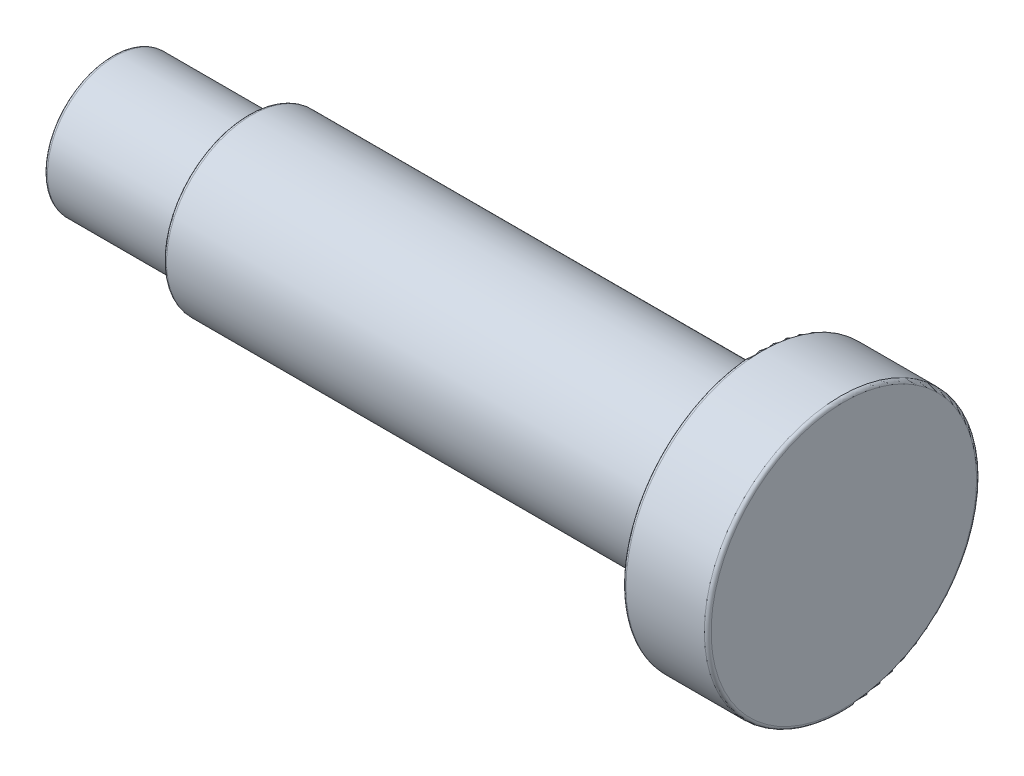
ISO-10303-21;
HEADER;
FILE_DESCRIPTION(('STEP AP214'),'2;1');
FILE_NAME('part.step','',(''),(''),'','','');
FILE_SCHEMA(('AUTOMOTIVE_DESIGN { 1 0 10303 214 1 1 1 1 }'));
ENDSEC;
DATA;
#1=APPLICATION_CONTEXT('core data for automotive mechanical design processes');
#2=APPLICATION_PROTOCOL_DEFINITION('international standard','automotive_design',2000,#1);
#3=PRODUCT_CONTEXT('',#1,'mechanical');
#4=PRODUCT('Part','Part','',(#3));
#5=PRODUCT_RELATED_PRODUCT_CATEGORY('part','',(#4));
#6=PRODUCT_DEFINITION_FORMATION('','',#4);
#7=PRODUCT_DEFINITION_CONTEXT('part definition',#1,'design');
#8=PRODUCT_DEFINITION('design','',#6,#7);
#9=PRODUCT_DEFINITION_SHAPE('','',#8);
#10=(LENGTH_UNIT() NAMED_UNIT(*) SI_UNIT(.MILLI.,.METRE.));
#11=(NAMED_UNIT(*) PLANE_ANGLE_UNIT() SI_UNIT($,.RADIAN.));
#12=(NAMED_UNIT(*) SI_UNIT($,.STERADIAN.) SOLID_ANGLE_UNIT());
#13=UNCERTAINTY_MEASURE_WITH_UNIT(LENGTH_MEASURE(1.E-05),#10,'distance_accuracy_value','');
#14=(GEOMETRIC_REPRESENTATION_CONTEXT(3) GLOBAL_UNCERTAINTY_ASSIGNED_CONTEXT((#13)) GLOBAL_UNIT_ASSIGNED_CONTEXT((#10,
#11,#12)) REPRESENTATION_CONTEXT('',''));
#15=CARTESIAN_POINT('',(0.,0.,0.));
#16=DIRECTION('',(0.,0.,1.));
#17=DIRECTION('',(1.,0.,0.));
#18=AXIS2_PLACEMENT_3D('',#15,#16,#17);
#19=CARTESIAN_POINT('',(190.5,0.,0.));
#20=DIRECTION('',(-1.,0.,0.));
#21=DIRECTION('',(0.,0.,1.));
#22=AXIS2_PLACEMENT_3D('',#19,#20,#21);
#23=CYLINDRICAL_SURFACE('',#22,63.5);
#24=CARTESIAN_POINT('',(-187.96,0.,0.));
#25=DIRECTION('',(1.,0.,0.));
#26=DIRECTION('',(0.,0.,-1.));
#27=AXIS2_PLACEMENT_3D('',#24,#25,#26);
#28=CIRCLE('',#27,63.5);
#29=CARTESIAN_POINT('',(-187.96,0.,-63.5));
#30=VERTEX_POINT('',#29);
#31=EDGE_CURVE('E45',#30,#30,#28,.T.);
#32=ORIENTED_EDGE('',*,*,#31,.T.);
#33=EDGE_LOOP('',(#32));
#34=FACE_BOUND('',#33,.T.);
#35=CARTESIAN_POINT('',(190.5,0.,0.));
#36=DIRECTION('',(1.,0.,0.));
#37=DIRECTION('',(0.,0.,-1.));
#38=AXIS2_PLACEMENT_3D('',#35,#36,#37);
#39=CIRCLE('',#38,63.5);
#40=CARTESIAN_POINT('',(190.5,0.,-63.5));
#41=VERTEX_POINT('',#40);
#42=EDGE_CURVE('E63',#41,#41,#39,.T.);
#43=ORIENTED_EDGE('',*,*,#42,.F.);
#44=EDGE_LOOP('',(#43));
#45=FACE_BOUND('',#44,.T.);
#46=ADVANCED_FACE('F30',(#34,#45),#23,.T.);
#47=CARTESIAN_POINT('',(-190.5,0.,0.));
#48=DIRECTION('',(1.,0.,0.));
#49=DIRECTION('',(0.,0.,-1.));
#50=AXIS2_PLACEMENT_3D('',#47,#48,#49);
#51=PLANE('',#50);
#52=CARTESIAN_POINT('',(-190.5,0.,0.));
#53=DIRECTION('',(1.,0.,0.));
#54=DIRECTION('',(0.,0.,-1.));
#55=AXIS2_PLACEMENT_3D('',#52,#53,#54);
#56=CIRCLE('',#55,60.96);
#57=CARTESIAN_POINT('',(-190.5,0.,-60.96));
#58=VERTEX_POINT('',#57);
#59=EDGE_CURVE('E41',#58,#58,#56,.F.);
#60=ORIENTED_EDGE('',*,*,#59,.T.);
#61=EDGE_LOOP('',(#60));
#62=FACE_BOUND('',#61,.T.);
#63=CARTESIAN_POINT('',(-190.5,0.,0.));
#64=DIRECTION('',(-1.,0.,0.));
#65=DIRECTION('',(0.,0.,1.));
#66=AXIS2_PLACEMENT_3D('',#63,#64,#65);
#67=CIRCLE('',#66,50.8);
#68=CARTESIAN_POINT('',(-190.5,0.,50.8));
#69=VERTEX_POINT('',#68);
#70=EDGE_CURVE('E62',#69,#69,#67,.T.);
#71=ORIENTED_EDGE('',*,*,#70,.F.);
#72=EDGE_LOOP('',(#71));
#73=FACE_BOUND('',#72,.T.);
#74=ADVANCED_FACE('F71',(#62,#73),#51,.F.);
#75=CARTESIAN_POINT('',(-292.1,0.,0.));
#76=DIRECTION('',(1.,0.,0.));
#77=DIRECTION('',(0.,0.,-1.));
#78=AXIS2_PLACEMENT_3D('',#75,#76,#77);
#79=CYLINDRICAL_SURFACE('',#78,50.8);
#80=CARTESIAN_POINT('',(-289.56,0.,0.));
#81=DIRECTION('',(-1.,0.,0.));
#82=DIRECTION('',(0.,0.,1.));
#83=AXIS2_PLACEMENT_3D('',#80,#81,#82);
#84=CIRCLE('',#83,50.8);
#85=CARTESIAN_POINT('',(-289.56,0.,50.8));
#86=VERTEX_POINT('',#85);
#87=EDGE_CURVE('E10',#86,#86,#84,.F.);
#88=ORIENTED_EDGE('',*,*,#87,.T.);
#89=EDGE_LOOP('',(#88));
#90=FACE_BOUND('',#89,.T.);
#91=ORIENTED_EDGE('',*,*,#70,.T.);
#92=EDGE_LOOP('',(#91));
#93=FACE_BOUND('',#92,.T.);
#94=ADVANCED_FACE('F69',(#90,#93),#79,.T.);
#95=CARTESIAN_POINT('',(-292.1,0.,0.));
#96=DIRECTION('',(-1.,0.,0.));
#97=DIRECTION('',(0.,0.,1.));
#98=AXIS2_PLACEMENT_3D('',#95,#96,#97);
#99=PLANE('',#98);
#100=CARTESIAN_POINT('',(-292.1,0.,0.));
#101=DIRECTION('',(-1.,0.,0.));
#102=DIRECTION('',(0.,0.,1.));
#103=AXIS2_PLACEMENT_3D('',#100,#101,#102);
#104=CIRCLE('',#103,48.26);
#105=CARTESIAN_POINT('',(-292.1,0.,48.26));
#106=VERTEX_POINT('',#105);
#107=EDGE_CURVE('E37',#106,#106,#104,.T.);
#108=ORIENTED_EDGE('',*,*,#107,.T.);
#109=EDGE_LOOP('',(#108));
#110=FACE_BOUND('',#109,.T.);
#111=ADVANCED_FACE('F79',(#110),#99,.T.);
#112=CARTESIAN_POINT('',(254.,0.,0.));
#113=DIRECTION('',(-1.,0.,0.));
#114=DIRECTION('',(0.,0.,1.));
#115=AXIS2_PLACEMENT_3D('',#112,#113,#114);
#116=CYLINDRICAL_SURFACE('',#115,101.6);
#117=CARTESIAN_POINT('',(193.04,0.,0.));
#118=DIRECTION('',(1.,0.,0.));
#119=DIRECTION('',(0.,0.,-1.));
#120=AXIS2_PLACEMENT_3D('',#117,#118,#119);
#121=CIRCLE('',#120,101.6);
#122=CARTESIAN_POINT('',(193.04,0.,-101.6));
#123=VERTEX_POINT('',#122);
#124=EDGE_CURVE('E56',#123,#123,#121,.T.);
#125=ORIENTED_EDGE('',*,*,#124,.T.);
#126=EDGE_LOOP('',(#125));
#127=FACE_BOUND('',#126,.T.);
#128=CARTESIAN_POINT('',(251.46,0.,0.));
#129=DIRECTION('',(1.,0.,0.));
#130=DIRECTION('',(0.,0.,-1.));
#131=AXIS2_PLACEMENT_3D('',#128,#129,#130);
#132=CIRCLE('',#131,101.6);
#133=CARTESIAN_POINT('',(251.46,0.,-101.6));
#134=VERTEX_POINT('',#133);
#135=EDGE_CURVE('E59',#134,#134,#132,.F.);
#136=ORIENTED_EDGE('',*,*,#135,.T.);
#137=EDGE_LOOP('',(#136));
#138=FACE_BOUND('',#137,.T.);
#139=ADVANCED_FACE('F113',(#127,#138),#116,.T.);
#140=CARTESIAN_POINT('',(254.,0.,0.));
#141=DIRECTION('',(1.,0.,0.));
#142=DIRECTION('',(0.,0.,-1.));
#143=AXIS2_PLACEMENT_3D('',#140,#141,#142);
#144=PLANE('',#143);
#145=CARTESIAN_POINT('',(254.,0.,0.));
#146=DIRECTION('',(1.,0.,0.));
#147=DIRECTION('',(0.,0.,-1.));
#148=AXIS2_PLACEMENT_3D('',#145,#146,#147);
#149=CIRCLE('',#148,99.06);
#150=CARTESIAN_POINT('',(254.,0.,-99.06));
#151=VERTEX_POINT('',#150);
#152=EDGE_CURVE('E50',#151,#151,#149,.T.);
#153=ORIENTED_EDGE('',*,*,#152,.T.);
#154=EDGE_LOOP('',(#153));
#155=FACE_BOUND('',#154,.T.);
#156=ADVANCED_FACE('F107',(#155),#144,.T.);
#157=CARTESIAN_POINT('',(190.5,0.,0.));
#158=DIRECTION('',(1.,0.,0.));
#159=DIRECTION('',(0.,0.,-1.));
#160=AXIS2_PLACEMENT_3D('',#157,#158,#159);
#161=PLANE('',#160);
#162=CARTESIAN_POINT('',(190.5,0.,0.));
#163=DIRECTION('',(1.,0.,0.));
#164=DIRECTION('',(0.,0.,-1.));
#165=AXIS2_PLACEMENT_3D('',#162,#163,#164);
#166=CIRCLE('',#165,99.06);
#167=CARTESIAN_POINT('',(190.5,0.,-99.06));
#168=VERTEX_POINT('',#167);
#169=EDGE_CURVE('E53',#168,#168,#166,.F.);
#170=ORIENTED_EDGE('',*,*,#169,.T.);
#171=EDGE_LOOP('',(#170));
#172=FACE_BOUND('',#171,.T.);
#173=ORIENTED_EDGE('',*,*,#42,.T.);
#174=EDGE_LOOP('',(#173));
#175=FACE_BOUND('',#174,.T.);
#176=ADVANCED_FACE('F89',(#172,#175),#161,.F.);
#177=CARTESIAN_POINT('',(193.04,0.,0.));
#178=DIRECTION('',(1.,0.,0.));
#179=DIRECTION('',(0.,0.,-1.));
#180=AXIS2_PLACEMENT_3D('',#177,#178,#179);
#181=TOROIDAL_SURFACE('',#180,99.06,2.54);
#182=ORIENTED_EDGE('',*,*,#169,.F.);
#183=EDGE_LOOP('',(#182));
#184=FACE_BOUND('',#183,.T.);
#185=ORIENTED_EDGE('',*,*,#124,.F.);
#186=EDGE_LOOP('',(#185));
#187=FACE_BOUND('',#186,.T.);
#188=ADVANCED_FACE('F85',(#184,#187),#181,.T.);
#189=CARTESIAN_POINT('',(251.46,0.,0.));
#190=DIRECTION('',(1.,0.,0.));
#191=DIRECTION('',(0.,0.,-1.));
#192=AXIS2_PLACEMENT_3D('',#189,#190,#191);
#193=TOROIDAL_SURFACE('',#192,99.06,2.54);
#194=ORIENTED_EDGE('',*,*,#135,.F.);
#195=EDGE_LOOP('',(#194));
#196=FACE_BOUND('',#195,.T.);
#197=ORIENTED_EDGE('',*,*,#152,.F.);
#198=EDGE_LOOP('',(#197));
#199=FACE_BOUND('',#198,.T.);
#200=ADVANCED_FACE('F88',(#196,#199),#193,.T.);
#201=CARTESIAN_POINT('',(-187.96,0.,0.));
#202=DIRECTION('',(1.,0.,0.));
#203=DIRECTION('',(0.,0.,-1.));
#204=AXIS2_PLACEMENT_3D('',#201,#202,#203);
#205=TOROIDAL_SURFACE('',#204,60.96,2.54);
#206=ORIENTED_EDGE('',*,*,#59,.F.);
#207=EDGE_LOOP('',(#206));
#208=FACE_BOUND('',#207,.T.);
#209=ORIENTED_EDGE('',*,*,#31,.F.);
#210=EDGE_LOOP('',(#209));
#211=FACE_BOUND('',#210,.T.);
#212=ADVANCED_FACE('F92',(#208,#211),#205,.T.);
#213=CARTESIAN_POINT('',(-289.56,0.,0.));
#214=DIRECTION('',(-1.,0.,0.));
#215=DIRECTION('',(0.,0.,1.));
#216=AXIS2_PLACEMENT_3D('',#213,#214,#215);
#217=TOROIDAL_SURFACE('',#216,48.26,2.54);
#218=ORIENTED_EDGE('',*,*,#87,.F.);
#219=EDGE_LOOP('',(#218));
#220=FACE_BOUND('',#219,.T.);
#221=ORIENTED_EDGE('',*,*,#107,.F.);
#222=EDGE_LOOP('',(#221));
#223=FACE_BOUND('',#222,.T.);
#224=ADVANCED_FACE('F32',(#220,#223),#217,.T.);
#225=CLOSED_SHELL('',(#46,#74,#94,#111,#139,#156,#176,#188,#200,#212,#224));
#226=MANIFOLD_SOLID_BREP('B2',#225);
#227=ADVANCED_BREP_SHAPE_REPRESENTATION('',(#18,#226),#14);
#228=SHAPE_DEFINITION_REPRESENTATION(#9,#227);
ENDSEC;
END-ISO-10303-21;
